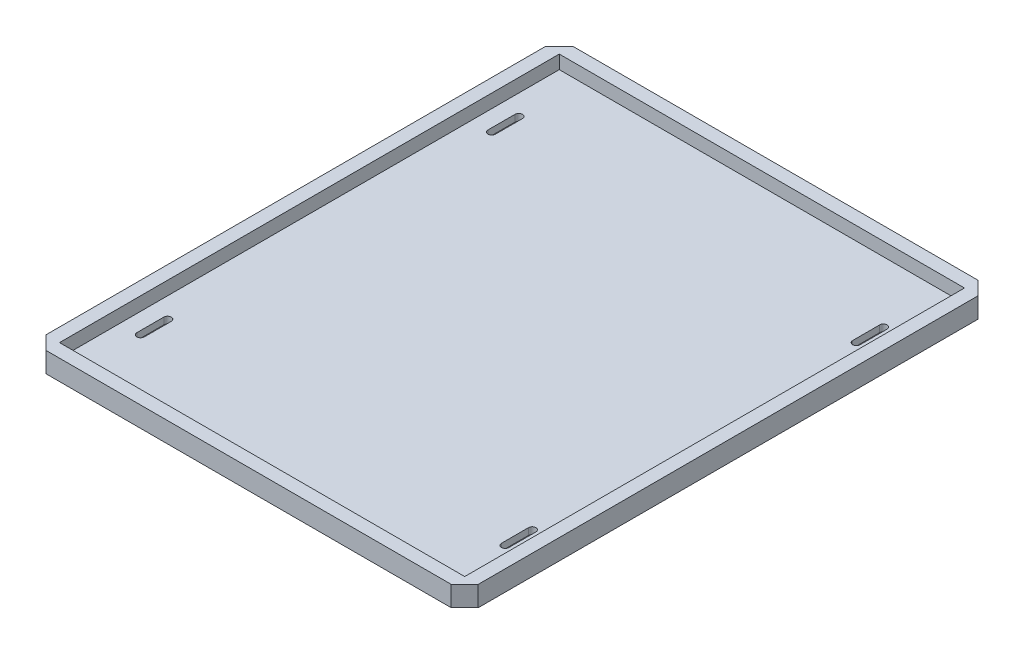
ISO-10303-21;
HEADER;
FILE_DESCRIPTION(('STEP AP214'),'2;1');
FILE_NAME('part.step','',(''),(''),'','','');
FILE_SCHEMA(('AUTOMOTIVE_DESIGN { 1 0 10303 214 1 1 1 1 }'));
ENDSEC;
DATA;
#1=APPLICATION_CONTEXT('core data for automotive mechanical design processes');
#2=APPLICATION_PROTOCOL_DEFINITION('international standard','automotive_design',2000,#1);
#3=PRODUCT_CONTEXT('',#1,'mechanical');
#4=PRODUCT('Part','Part','',(#3));
#5=PRODUCT_RELATED_PRODUCT_CATEGORY('part','',(#4));
#6=PRODUCT_DEFINITION_FORMATION('','',#4);
#7=PRODUCT_DEFINITION_CONTEXT('part definition',#1,'design');
#8=PRODUCT_DEFINITION('design','',#6,#7);
#9=PRODUCT_DEFINITION_SHAPE('','',#8);
#10=(LENGTH_UNIT() NAMED_UNIT(*) SI_UNIT(.MILLI.,.METRE.));
#11=(NAMED_UNIT(*) PLANE_ANGLE_UNIT() SI_UNIT($,.RADIAN.));
#12=(NAMED_UNIT(*) SI_UNIT($,.STERADIAN.) SOLID_ANGLE_UNIT());
#13=UNCERTAINTY_MEASURE_WITH_UNIT(LENGTH_MEASURE(1.E-05),#10,'distance_accuracy_value','');
#14=(GEOMETRIC_REPRESENTATION_CONTEXT(3) GLOBAL_UNCERTAINTY_ASSIGNED_CONTEXT((#13)) GLOBAL_UNIT_ASSIGNED_CONTEXT((#10,
#11,#12)) REPRESENTATION_CONTEXT('',''));
#15=CARTESIAN_POINT('',(0.,0.,0.));
#16=DIRECTION('',(0.,0.,1.));
#17=DIRECTION('',(1.,0.,0.));
#18=AXIS2_PLACEMENT_3D('',#15,#16,#17);
#19=CARTESIAN_POINT('',(0.,5.,0.));
#20=DIRECTION('',(0.,-1.,0.));
#21=DIRECTION('',(0.,0.,-1.));
#22=AXIS2_PLACEMENT_3D('',#19,#20,#21);
#23=PLANE('',#22);
#24=DIRECTION('',(1.,0.,0.));
#25=VECTOR('',#24,1.);
#26=CARTESIAN_POINT('',(0.,5.,185.));
#27=LINE('',#26,#25);
#28=CARTESIAN_POINT('',(-150.,5.,185.));
#29=VERTEX_POINT('',#28);
#30=CARTESIAN_POINT('',(150.,5.,185.));
#31=VERTEX_POINT('',#30);
#32=EDGE_CURVE('E291',#29,#31,#27,.T.);
#33=ORIENTED_EDGE('',*,*,#32,.T.);
#34=DIRECTION('',(0.,0.,-1.));
#35=VECTOR('',#34,1.);
#36=CARTESIAN_POINT('',(150.,5.,0.));
#37=LINE('',#36,#35);
#38=CARTESIAN_POINT('',(150.,5.,-185.));
#39=VERTEX_POINT('',#38);
#40=EDGE_CURVE('E301',#31,#39,#37,.T.);
#41=ORIENTED_EDGE('',*,*,#40,.T.);
#42=DIRECTION('',(-1.,0.,0.));
#43=VECTOR('',#42,1.);
#44=CARTESIAN_POINT('',(0.,5.,-185.));
#45=LINE('',#44,#43);
#46=CARTESIAN_POINT('',(-150.,5.,-185.));
#47=VERTEX_POINT('',#46);
#48=EDGE_CURVE('E253',#39,#47,#45,.T.);
#49=ORIENTED_EDGE('',*,*,#48,.T.);
#50=DIRECTION('',(0.,0.,1.));
#51=VECTOR('',#50,1.);
#52=CARTESIAN_POINT('',(-150.,5.,0.));
#53=LINE('',#52,#51);
#54=EDGE_CURVE('E295',#47,#29,#53,.T.);
#55=ORIENTED_EDGE('',*,*,#54,.T.);
#56=EDGE_LOOP('',(#33,#41,#49,#55));
#57=FACE_BOUND('',#56,.T.);
#58=CARTESIAN_POINT('',(135.,5.,-140.));
#59=DIRECTION('',(0.,-1.,0.));
#60=DIRECTION('',(0.,0.,-1.));
#61=AXIS2_PLACEMENT_3D('',#58,#59,#60);
#62=CIRCLE('',#61,2.74999999999997);
#63=CARTESIAN_POINT('',(132.25,5.,-140.));
#64=VERTEX_POINT('',#63);
#65=CARTESIAN_POINT('',(137.75,5.,-140.));
#66=VERTEX_POINT('',#65);
#67=EDGE_CURVE('E334',#64,#66,#62,.T.);
#68=ORIENTED_EDGE('',*,*,#67,.T.);
#69=DIRECTION('',(0.,0.,1.));
#70=VECTOR('',#69,1.);
#71=CARTESIAN_POINT('',(137.75,5.,-140.));
#72=LINE('',#71,#70);
#73=CARTESIAN_POINT('',(137.75,5.,-120.));
#74=VERTEX_POINT('',#73);
#75=EDGE_CURVE('E330',#66,#74,#72,.T.);
#76=ORIENTED_EDGE('',*,*,#75,.T.);
#77=CARTESIAN_POINT('',(135.,5.,-120.));
#78=DIRECTION('',(0.,-1.,0.));
#79=DIRECTION('',(0.,0.,-1.));
#80=AXIS2_PLACEMENT_3D('',#77,#78,#79);
#81=CIRCLE('',#80,2.74999999999997);
#82=CARTESIAN_POINT('',(132.25,5.,-120.));
#83=VERTEX_POINT('',#82);
#84=EDGE_CURVE('E325',#74,#83,#81,.T.);
#85=ORIENTED_EDGE('',*,*,#84,.T.);
#86=DIRECTION('',(0.,0.,1.));
#87=VECTOR('',#86,1.);
#88=CARTESIAN_POINT('',(132.25,5.,-140.));
#89=LINE('',#88,#87);
#90=EDGE_CURVE('E321',#64,#83,#89,.T.);
#91=ORIENTED_EDGE('',*,*,#90,.F.);
#92=EDGE_LOOP('',(#68,#76,#85,#91));
#93=FACE_BOUND('',#92,.T.);
#94=DIRECTION('',(0.,0.,1.));
#95=VECTOR('',#94,1.);
#96=CARTESIAN_POINT('',(-137.75,5.,-140.));
#97=LINE('',#96,#95);
#98=CARTESIAN_POINT('',(-137.75,5.,-140.));
#99=VERTEX_POINT('',#98);
#100=CARTESIAN_POINT('',(-137.75,5.,-120.));
#101=VERTEX_POINT('',#100);
#102=EDGE_CURVE('E455',#99,#101,#97,.T.);
#103=ORIENTED_EDGE('',*,*,#102,.F.);
#104=CARTESIAN_POINT('',(-135.,5.,-140.));
#105=DIRECTION('',(0.,1.,0.));
#106=DIRECTION('',(0.,0.,1.));
#107=AXIS2_PLACEMENT_3D('',#104,#105,#106);
#108=CIRCLE('',#107,2.74999999999997);
#109=CARTESIAN_POINT('',(-132.25,5.,-140.));
#110=VERTEX_POINT('',#109);
#111=EDGE_CURVE('E338',#110,#99,#108,.T.);
#112=ORIENTED_EDGE('',*,*,#111,.F.);
#113=DIRECTION('',(0.,0.,1.));
#114=VECTOR('',#113,1.);
#115=CARTESIAN_POINT('',(-132.25,5.,-140.));
#116=LINE('',#115,#114);
#117=CARTESIAN_POINT('',(-132.25,5.,-120.));
#118=VERTEX_POINT('',#117);
#119=EDGE_CURVE('E441',#110,#118,#116,.T.);
#120=ORIENTED_EDGE('',*,*,#119,.T.);
#121=CARTESIAN_POINT('',(-135.,5.,-120.));
#122=DIRECTION('',(0.,1.,0.));
#123=DIRECTION('',(0.,0.,1.));
#124=AXIS2_PLACEMENT_3D('',#121,#122,#123);
#125=CIRCLE('',#124,2.74999999999997);
#126=EDGE_CURVE('E459',#101,#118,#125,.T.);
#127=ORIENTED_EDGE('',*,*,#126,.F.);
#128=EDGE_LOOP('',(#103,#112,#120,#127));
#129=FACE_BOUND('',#128,.T.);
#130=DIRECTION('',(0.,0.,-1.));
#131=VECTOR('',#130,1.);
#132=CARTESIAN_POINT('',(137.75,5.,140.));
#133=LINE('',#132,#131);
#134=CARTESIAN_POINT('',(137.75,5.,140.));
#135=VERTEX_POINT('',#134);
#136=CARTESIAN_POINT('',(137.75,5.,120.));
#137=VERTEX_POINT('',#136);
#138=EDGE_CURVE('E375',#135,#137,#133,.T.);
#139=ORIENTED_EDGE('',*,*,#138,.F.);
#140=CARTESIAN_POINT('',(135.,5.,140.));
#141=DIRECTION('',(0.,1.,0.));
#142=DIRECTION('',(0.,0.,1.));
#143=AXIS2_PLACEMENT_3D('',#140,#141,#142);
#144=CIRCLE('',#143,2.74999999999997);
#145=CARTESIAN_POINT('',(132.25,5.,140.));
#146=VERTEX_POINT('',#145);
#147=EDGE_CURVE('E310',#146,#135,#144,.T.);
#148=ORIENTED_EDGE('',*,*,#147,.F.);
#149=DIRECTION('',(0.,0.,-1.));
#150=VECTOR('',#149,1.);
#151=CARTESIAN_POINT('',(132.25,5.,140.));
#152=LINE('',#151,#150);
#153=CARTESIAN_POINT('',(132.25,5.,120.));
#154=VERTEX_POINT('',#153);
#155=EDGE_CURVE('E366',#146,#154,#152,.T.);
#156=ORIENTED_EDGE('',*,*,#155,.T.);
#157=CARTESIAN_POINT('',(135.,5.,120.));
#158=DIRECTION('',(0.,1.,0.));
#159=DIRECTION('',(0.,0.,1.));
#160=AXIS2_PLACEMENT_3D('',#157,#158,#159);
#161=CIRCLE('',#160,2.74999999999997);
#162=EDGE_CURVE('E370',#137,#154,#161,.T.);
#163=ORIENTED_EDGE('',*,*,#162,.F.);
#164=EDGE_LOOP('',(#139,#148,#156,#163));
#165=FACE_BOUND('',#164,.T.);
#166=CARTESIAN_POINT('',(-135.,5.,140.));
#167=DIRECTION('',(0.,-1.,0.));
#168=DIRECTION('',(0.,0.,-1.));
#169=AXIS2_PLACEMENT_3D('',#166,#167,#168);
#170=CIRCLE('',#169,2.74999999999997);
#171=CARTESIAN_POINT('',(-132.25,5.,140.));
#172=VERTEX_POINT('',#171);
#173=CARTESIAN_POINT('',(-137.75,5.,140.));
#174=VERTEX_POINT('',#173);
#175=EDGE_CURVE('E365',#172,#174,#170,.T.);
#176=ORIENTED_EDGE('',*,*,#175,.T.);
#177=DIRECTION('',(0.,0.,-1.));
#178=VECTOR('',#177,1.);
#179=CARTESIAN_POINT('',(-137.75,5.,140.));
#180=LINE('',#179,#178);
#181=CARTESIAN_POINT('',(-137.75,5.,120.));
#182=VERTEX_POINT('',#181);
#183=EDGE_CURVE('E417',#174,#182,#180,.T.);
#184=ORIENTED_EDGE('',*,*,#183,.T.);
#185=CARTESIAN_POINT('',(-135.,5.,120.));
#186=DIRECTION('',(0.,-1.,0.));
#187=DIRECTION('',(0.,0.,-1.));
#188=AXIS2_PLACEMENT_3D('',#185,#186,#187);
#189=CIRCLE('',#188,2.74999999999997);
#190=CARTESIAN_POINT('',(-132.25,5.,120.));
#191=VERTEX_POINT('',#190);
#192=EDGE_CURVE('E412',#182,#191,#189,.T.);
#193=ORIENTED_EDGE('',*,*,#192,.T.);
#194=DIRECTION('',(0.,0.,-1.));
#195=VECTOR('',#194,1.);
#196=CARTESIAN_POINT('',(-132.25,5.,140.));
#197=LINE('',#196,#195);
#198=EDGE_CURVE('E408',#172,#191,#197,.T.);
#199=ORIENTED_EDGE('',*,*,#198,.F.);
#200=EDGE_LOOP('',(#176,#184,#193,#199));
#201=FACE_BOUND('',#200,.T.);
#202=ADVANCED_FACE('F47',(#57,#93,#129,#165,#201),#23,.F.);
#203=CARTESIAN_POINT('',(0.,0.,0.));
#204=DIRECTION('',(0.,-1.,0.));
#205=DIRECTION('',(0.,0.,-1.));
#206=AXIS2_PLACEMENT_3D('',#203,#204,#205);
#207=PLANE('',#206);
#208=CARTESIAN_POINT('',(135.,0.,140.));
#209=DIRECTION('',(0.,1.,0.));
#210=DIRECTION('',(0.,0.,1.));
#211=AXIS2_PLACEMENT_3D('',#208,#209,#210);
#212=CIRCLE('',#211,2.74999999999997);
#213=CARTESIAN_POINT('',(132.25,0.,140.));
#214=VERTEX_POINT('',#213);
#215=CARTESIAN_POINT('',(137.75,0.,140.));
#216=VERTEX_POINT('',#215);
#217=EDGE_CURVE('E371',#214,#216,#212,.T.);
#218=ORIENTED_EDGE('',*,*,#217,.T.);
#219=DIRECTION('',(0.,0.,-1.));
#220=VECTOR('',#219,1.);
#221=CARTESIAN_POINT('',(137.75,0.,140.));
#222=LINE('',#221,#220);
#223=CARTESIAN_POINT('',(137.75,0.,120.));
#224=VERTEX_POINT('',#223);
#225=EDGE_CURVE('E387',#216,#224,#222,.T.);
#226=ORIENTED_EDGE('',*,*,#225,.T.);
#227=CARTESIAN_POINT('',(135.,0.,120.));
#228=DIRECTION('',(0.,1.,0.));
#229=DIRECTION('',(0.,0.,1.));
#230=AXIS2_PLACEMENT_3D('',#227,#228,#229);
#231=CIRCLE('',#230,2.74999999999997);
#232=CARTESIAN_POINT('',(132.25,0.,120.));
#233=VERTEX_POINT('',#232);
#234=EDGE_CURVE('E383',#224,#233,#231,.T.);
#235=ORIENTED_EDGE('',*,*,#234,.T.);
#236=DIRECTION('',(0.,0.,-1.));
#237=VECTOR('',#236,1.);
#238=CARTESIAN_POINT('',(132.25,0.,140.));
#239=LINE('',#238,#237);
#240=EDGE_CURVE('E355',#214,#233,#239,.T.);
#241=ORIENTED_EDGE('',*,*,#240,.F.);
#242=EDGE_LOOP('',(#218,#226,#235,#241));
#243=FACE_BOUND('',#242,.T.);
#244=CARTESIAN_POINT('',(-135.,0.,-140.));
#245=DIRECTION('',(0.,1.,0.));
#246=DIRECTION('',(0.,0.,1.));
#247=AXIS2_PLACEMENT_3D('',#244,#245,#246);
#248=CIRCLE('',#247,2.74999999999997);
#249=CARTESIAN_POINT('',(-132.25,0.,-140.));
#250=VERTEX_POINT('',#249);
#251=CARTESIAN_POINT('',(-137.75,0.,-140.));
#252=VERTEX_POINT('',#251);
#253=EDGE_CURVE('E436',#250,#252,#248,.T.);
#254=ORIENTED_EDGE('',*,*,#253,.T.);
#255=DIRECTION('',(0.,0.,1.));
#256=VECTOR('',#255,1.);
#257=CARTESIAN_POINT('',(-137.75,0.,-140.));
#258=LINE('',#257,#256);
#259=CARTESIAN_POINT('',(-137.75,0.,-120.));
#260=VERTEX_POINT('',#259);
#261=EDGE_CURVE('E440',#252,#260,#258,.T.);
#262=ORIENTED_EDGE('',*,*,#261,.T.);
#263=CARTESIAN_POINT('',(-135.,0.,-120.));
#264=DIRECTION('',(0.,1.,0.));
#265=DIRECTION('',(0.,0.,1.));
#266=AXIS2_PLACEMENT_3D('',#263,#264,#265);
#267=CIRCLE('',#266,2.74999999999997);
#268=CARTESIAN_POINT('',(-132.25,0.,-120.));
#269=VERTEX_POINT('',#268);
#270=EDGE_CURVE('E445',#260,#269,#267,.T.);
#271=ORIENTED_EDGE('',*,*,#270,.T.);
#272=DIRECTION('',(0.,0.,1.));
#273=VECTOR('',#272,1.);
#274=CARTESIAN_POINT('',(-132.25,0.,-140.));
#275=LINE('',#274,#273);
#276=EDGE_CURVE('E449',#250,#269,#275,.T.);
#277=ORIENTED_EDGE('',*,*,#276,.F.);
#278=EDGE_LOOP('',(#254,#262,#271,#277));
#279=FACE_BOUND('',#278,.T.);
#280=DIRECTION('',(0.,0.,1.));
#281=VECTOR('',#280,1.);
#282=CARTESIAN_POINT('',(137.75,0.,-140.));
#283=LINE('',#282,#281);
#284=CARTESIAN_POINT('',(137.75,0.,-140.));
#285=VERTEX_POINT('',#284);
#286=CARTESIAN_POINT('',(137.75,0.,-120.));
#287=VERTEX_POINT('',#286);
#288=EDGE_CURVE('E346',#285,#287,#283,.T.);
#289=ORIENTED_EDGE('',*,*,#288,.F.);
#290=CARTESIAN_POINT('',(135.,0.,-140.));
#291=DIRECTION('',(0.,-1.,0.));
#292=DIRECTION('',(0.,0.,-1.));
#293=AXIS2_PLACEMENT_3D('',#290,#291,#292);
#294=CIRCLE('',#293,2.74999999999997);
#295=CARTESIAN_POINT('',(132.25,0.,-140.));
#296=VERTEX_POINT('',#295);
#297=EDGE_CURVE('E326',#296,#285,#294,.T.);
#298=ORIENTED_EDGE('',*,*,#297,.F.);
#299=DIRECTION('',(0.,0.,1.));
#300=VECTOR('',#299,1.);
#301=CARTESIAN_POINT('',(132.25,0.,-140.));
#302=LINE('',#301,#300);
#303=CARTESIAN_POINT('',(132.25,0.,-120.));
#304=VERTEX_POINT('',#303);
#305=EDGE_CURVE('E320',#296,#304,#302,.T.);
#306=ORIENTED_EDGE('',*,*,#305,.T.);
#307=CARTESIAN_POINT('',(135.,0.,-120.));
#308=DIRECTION('',(0.,-1.,0.));
#309=DIRECTION('',(0.,0.,-1.));
#310=AXIS2_PLACEMENT_3D('',#307,#308,#309);
#311=CIRCLE('',#310,2.74999999999997);
#312=EDGE_CURVE('E342',#287,#304,#311,.T.);
#313=ORIENTED_EDGE('',*,*,#312,.F.);
#314=EDGE_LOOP('',(#289,#298,#306,#313));
#315=FACE_BOUND('',#314,.T.);
#316=DIRECTION('',(0.,0.,-1.));
#317=VECTOR('',#316,1.);
#318=CARTESIAN_POINT('',(-137.75,0.,140.));
#319=LINE('',#318,#317);
#320=CARTESIAN_POINT('',(-137.75,0.,140.));
#321=VERTEX_POINT('',#320);
#322=CARTESIAN_POINT('',(-137.75,0.,120.));
#323=VERTEX_POINT('',#322);
#324=EDGE_CURVE('E431',#321,#323,#319,.T.);
#325=ORIENTED_EDGE('',*,*,#324,.F.);
#326=CARTESIAN_POINT('',(-135.,0.,140.));
#327=DIRECTION('',(0.,-1.,0.));
#328=DIRECTION('',(0.,0.,-1.));
#329=AXIS2_PLACEMENT_3D('',#326,#327,#328);
#330=CIRCLE('',#329,2.74999999999997);
#331=CARTESIAN_POINT('',(-132.25,0.,140.));
#332=VERTEX_POINT('',#331);
#333=EDGE_CURVE('E413',#332,#321,#330,.T.);
#334=ORIENTED_EDGE('',*,*,#333,.F.);
#335=DIRECTION('',(0.,0.,-1.));
#336=VECTOR('',#335,1.);
#337=CARTESIAN_POINT('',(-132.25,0.,140.));
#338=LINE('',#337,#336);
#339=CARTESIAN_POINT('',(-132.25,0.,120.));
#340=VERTEX_POINT('',#339);
#341=EDGE_CURVE('E407',#332,#340,#338,.T.);
#342=ORIENTED_EDGE('',*,*,#341,.T.);
#343=CARTESIAN_POINT('',(-135.,0.,120.));
#344=DIRECTION('',(0.,-1.,0.));
#345=DIRECTION('',(0.,0.,-1.));
#346=AXIS2_PLACEMENT_3D('',#343,#344,#345);
#347=CIRCLE('',#346,2.74999999999997);
#348=EDGE_CURVE('E427',#323,#340,#347,.T.);
#349=ORIENTED_EDGE('',*,*,#348,.F.);
#350=EDGE_LOOP('',(#325,#334,#342,#349));
#351=FACE_BOUND('',#350,.T.);
#352=DIRECTION('',(0.,0.,1.));
#353=VECTOR('',#352,1.);
#354=CARTESIAN_POINT('',(-160.,0.,-195.));
#355=LINE('',#354,#353);
#356=CARTESIAN_POINT('',(-160.,0.,-185.));
#357=VERTEX_POINT('',#356);
#358=CARTESIAN_POINT('',(-160.,0.,185.));
#359=VERTEX_POINT('',#358);
#360=EDGE_CURVE('E489',#357,#359,#355,.T.);
#361=ORIENTED_EDGE('',*,*,#360,.F.);
#362=DIRECTION('',(0.707106781186549,0.,-0.707106781186546));
#363=VECTOR('',#362,1.);
#364=CARTESIAN_POINT('',(-172.5,0.,-172.500000000001));
#365=LINE('',#364,#363);
#366=CARTESIAN_POINT('',(-150.,0.,-195.));
#367=VERTEX_POINT('',#366);
#368=EDGE_CURVE('E509',#357,#367,#365,.T.);
#369=ORIENTED_EDGE('',*,*,#368,.T.);
#370=DIRECTION('',(1.,0.,0.));
#371=VECTOR('',#370,1.);
#372=CARTESIAN_POINT('',(-160.,0.,-195.));
#373=LINE('',#372,#371);
#374=CARTESIAN_POINT('',(150.,0.,-195.));
#375=VERTEX_POINT('',#374);
#376=EDGE_CURVE('E469',#367,#375,#373,.T.);
#377=ORIENTED_EDGE('',*,*,#376,.T.);
#378=DIRECTION('',(-0.707106781186546,0.,-0.707106781186549));
#379=VECTOR('',#378,1.);
#380=CARTESIAN_POINT('',(172.5,0.,-172.499999999999));
#381=LINE('',#380,#379);
#382=CARTESIAN_POINT('',(160.,0.,-185.));
#383=VERTEX_POINT('',#382);
#384=EDGE_CURVE('E506',#375,#383,#381,.F.);
#385=ORIENTED_EDGE('',*,*,#384,.T.);
#386=DIRECTION('',(0.,0.,1.));
#387=VECTOR('',#386,1.);
#388=CARTESIAN_POINT('',(160.,0.,-195.));
#389=LINE('',#388,#387);
#390=CARTESIAN_POINT('',(160.,0.,185.));
#391=VERTEX_POINT('',#390);
#392=EDGE_CURVE('E482',#383,#391,#389,.T.);
#393=ORIENTED_EDGE('',*,*,#392,.T.);
#394=DIRECTION('',(-0.707106781186548,0.,0.707106781186548));
#395=VECTOR('',#394,1.);
#396=CARTESIAN_POINT('',(172.5,0.,172.5));
#397=LINE('',#396,#395);
#398=CARTESIAN_POINT('',(150.,0.,195.));
#399=VERTEX_POINT('',#398);
#400=EDGE_CURVE('E503',#391,#399,#397,.T.);
#401=ORIENTED_EDGE('',*,*,#400,.T.);
#402=DIRECTION('',(1.,0.,0.));
#403=VECTOR('',#402,1.);
#404=CARTESIAN_POINT('',(-160.,0.,195.));
#405=LINE('',#404,#403);
#406=CARTESIAN_POINT('',(-150.,0.,195.));
#407=VERTEX_POINT('',#406);
#408=EDGE_CURVE('E486',#407,#399,#405,.T.);
#409=ORIENTED_EDGE('',*,*,#408,.F.);
#410=DIRECTION('',(0.707106781186546,0.,0.707106781186549));
#411=VECTOR('',#410,1.);
#412=CARTESIAN_POINT('',(-172.5,0.,172.499999999999));
#413=LINE('',#412,#411);
#414=EDGE_CURVE('E500',#407,#359,#413,.F.);
#415=ORIENTED_EDGE('',*,*,#414,.T.);
#416=EDGE_LOOP('',(#361,#369,#377,#385,#393,#401,#409,#415));
#417=FACE_BOUND('',#416,.T.);
#418=ADVANCED_FACE('F544',(#243,#279,#315,#351,#417),#207,.T.);
#419=CARTESIAN_POINT('',(-160.,5.,-195.));
#420=DIRECTION('',(0.,0.,-1.));
#421=DIRECTION('',(-1.,0.,0.));
#422=AXIS2_PLACEMENT_3D('',#419,#420,#421);
#423=PLANE('',#422);
#424=ORIENTED_EDGE('',*,*,#376,.F.);
#425=DIRECTION('',(0.,1.,0.));
#426=VECTOR('',#425,1.);
#427=CARTESIAN_POINT('',(-150.,15.,-195.));
#428=LINE('',#427,#426);
#429=CARTESIAN_POINT('',(-150.,15.,-195.));
#430=VERTEX_POINT('',#429);
#431=EDGE_CURVE('E516',#367,#430,#428,.T.);
#432=ORIENTED_EDGE('',*,*,#431,.T.);
#433=DIRECTION('',(-1.,0.,0.));
#434=VECTOR('',#433,1.);
#435=CARTESIAN_POINT('',(-160.,15.,-195.));
#436=LINE('',#435,#434);
#437=CARTESIAN_POINT('',(150.,15.,-195.));
#438=VERTEX_POINT('',#437);
#439=EDGE_CURVE('E281',#438,#430,#436,.T.);
#440=ORIENTED_EDGE('',*,*,#439,.F.);
#441=DIRECTION('',(0.,-1.,0.));
#442=VECTOR('',#441,1.);
#443=CARTESIAN_POINT('',(150.,5.,-195.));
#444=LINE('',#443,#442);
#445=EDGE_CURVE('E512',#438,#375,#444,.T.);
#446=ORIENTED_EDGE('',*,*,#445,.T.);
#447=EDGE_LOOP('',(#424,#432,#440,#446));
#448=FACE_BOUND('',#447,.T.);
#449=ADVANCED_FACE('F561',(#448),#423,.T.);
#450=CARTESIAN_POINT('',(-160.,5.,-195.));
#451=DIRECTION('',(1.,0.,0.));
#452=DIRECTION('',(0.,0.,-1.));
#453=AXIS2_PLACEMENT_3D('',#450,#451,#452);
#454=PLANE('',#453);
#455=DIRECTION('',(0.,0.,1.));
#456=VECTOR('',#455,1.);
#457=CARTESIAN_POINT('',(-160.,15.,-195.));
#458=LINE('',#457,#456);
#459=CARTESIAN_POINT('',(-160.,15.,-185.));
#460=VERTEX_POINT('',#459);
#461=CARTESIAN_POINT('',(-160.,15.,185.));
#462=VERTEX_POINT('',#461);
#463=EDGE_CURVE('E285',#460,#462,#458,.T.);
#464=ORIENTED_EDGE('',*,*,#463,.F.);
#465=DIRECTION('',(0.,-1.,0.));
#466=VECTOR('',#465,1.);
#467=CARTESIAN_POINT('',(-160.,0.,-185.));
#468=LINE('',#467,#466);
#469=EDGE_CURVE('E496',#460,#357,#468,.T.);
#470=ORIENTED_EDGE('',*,*,#469,.T.);
#471=ORIENTED_EDGE('',*,*,#360,.T.);
#472=DIRECTION('',(0.,1.,0.));
#473=VECTOR('',#472,1.);
#474=CARTESIAN_POINT('',(-160.,5.,185.));
#475=LINE('',#474,#473);
#476=EDGE_CURVE('E493',#359,#462,#475,.T.);
#477=ORIENTED_EDGE('',*,*,#476,.T.);
#478=EDGE_LOOP('',(#464,#470,#471,#477));
#479=FACE_BOUND('',#478,.T.);
#480=ADVANCED_FACE('F569',(#479),#454,.F.);
#481=CARTESIAN_POINT('',(-160.,5.,195.));
#482=DIRECTION('',(0.,0.,-1.));
#483=DIRECTION('',(-1.,0.,0.));
#484=AXIS2_PLACEMENT_3D('',#481,#482,#483);
#485=PLANE('',#484);
#486=ORIENTED_EDGE('',*,*,#408,.T.);
#487=DIRECTION('',(0.,1.,0.));
#488=VECTOR('',#487,1.);
#489=CARTESIAN_POINT('',(150.,15.,195.));
#490=LINE('',#489,#488);
#491=CARTESIAN_POINT('',(150.,15.,195.));
#492=VERTEX_POINT('',#491);
#493=EDGE_CURVE('E11',#399,#492,#490,.T.);
#494=ORIENTED_EDGE('',*,*,#493,.T.);
#495=DIRECTION('',(1.,0.,0.));
#496=VECTOR('',#495,1.);
#497=CARTESIAN_POINT('',(-160.,15.,195.));
#498=LINE('',#497,#496);
#499=CARTESIAN_POINT('',(-150.,15.,195.));
#500=VERTEX_POINT('',#499);
#501=EDGE_CURVE('E288',#500,#492,#498,.T.);
#502=ORIENTED_EDGE('',*,*,#501,.F.);
#503=DIRECTION('',(0.,-1.,0.));
#504=VECTOR('',#503,1.);
#505=CARTESIAN_POINT('',(-150.,5.,195.));
#506=LINE('',#505,#504);
#507=EDGE_CURVE('E57',#500,#407,#506,.T.);
#508=ORIENTED_EDGE('',*,*,#507,.T.);
#509=EDGE_LOOP('',(#486,#494,#502,#508));
#510=FACE_BOUND('',#509,.T.);
#511=ADVANCED_FACE('F540',(#510),#485,.F.);
#512=CARTESIAN_POINT('',(160.,5.,-195.));
#513=DIRECTION('',(1.,0.,0.));
#514=DIRECTION('',(0.,0.,-1.));
#515=AXIS2_PLACEMENT_3D('',#512,#513,#514);
#516=PLANE('',#515);
#517=ORIENTED_EDGE('',*,*,#392,.F.);
#518=DIRECTION('',(0.,1.,0.));
#519=VECTOR('',#518,1.);
#520=CARTESIAN_POINT('',(160.,5.,-185.));
#521=LINE('',#520,#519);
#522=CARTESIAN_POINT('',(160.,15.,-185.));
#523=VERTEX_POINT('',#522);
#524=EDGE_CURVE('E534',#383,#523,#521,.T.);
#525=ORIENTED_EDGE('',*,*,#524,.T.);
#526=DIRECTION('',(0.,0.,-1.));
#527=VECTOR('',#526,1.);
#528=CARTESIAN_POINT('',(160.,15.,-195.));
#529=LINE('',#528,#527);
#530=CARTESIAN_POINT('',(160.,15.,185.));
#531=VERTEX_POINT('',#530);
#532=EDGE_CURVE('E255',#531,#523,#529,.T.);
#533=ORIENTED_EDGE('',*,*,#532,.F.);
#534=DIRECTION('',(0.,-1.,0.));
#535=VECTOR('',#534,1.);
#536=CARTESIAN_POINT('',(160.,0.,185.));
#537=LINE('',#536,#535);
#538=EDGE_CURVE('E530',#531,#391,#537,.T.);
#539=ORIENTED_EDGE('',*,*,#538,.T.);
#540=EDGE_LOOP('',(#517,#525,#533,#539));
#541=FACE_BOUND('',#540,.T.);
#542=ADVANCED_FACE('F552',(#541),#516,.T.);
#543=CARTESIAN_POINT('',(-135.,0.,-140.));
#544=DIRECTION('',(0.,1.,0.));
#545=DIRECTION('',(0.,0.,1.));
#546=AXIS2_PLACEMENT_3D('',#543,#544,#545);
#547=CYLINDRICAL_SURFACE('',#546,2.74999999999997);
#548=ORIENTED_EDGE('',*,*,#111,.T.);
#549=DIRECTION('',(0.,1.,0.));
#550=VECTOR('',#549,1.);
#551=CARTESIAN_POINT('',(-137.75,0.,-140.));
#552=LINE('',#551,#550);
#553=EDGE_CURVE('E452',#252,#99,#552,.T.);
#554=ORIENTED_EDGE('',*,*,#553,.F.);
#555=ORIENTED_EDGE('',*,*,#253,.F.);
#556=DIRECTION('',(0.,1.,0.));
#557=VECTOR('',#556,1.);
#558=CARTESIAN_POINT('',(-132.25,0.,-140.));
#559=LINE('',#558,#557);
#560=EDGE_CURVE('E466',#250,#110,#559,.T.);
#561=ORIENTED_EDGE('',*,*,#560,.T.);
#562=EDGE_LOOP('',(#548,#554,#555,#561));
#563=FACE_BOUND('',#562,.T.);
#564=ADVANCED_FACE('F587',(#563),#547,.F.);
#565=CARTESIAN_POINT('',(-132.25,0.,-140.));
#566=DIRECTION('',(-1.,0.,0.));
#567=DIRECTION('',(0.,0.,1.));
#568=AXIS2_PLACEMENT_3D('',#565,#566,#567);
#569=PLANE('',#568);
#570=ORIENTED_EDGE('',*,*,#119,.F.);
#571=ORIENTED_EDGE('',*,*,#560,.F.);
#572=ORIENTED_EDGE('',*,*,#276,.T.);
#573=DIRECTION('',(0.,1.,0.));
#574=VECTOR('',#573,1.);
#575=CARTESIAN_POINT('',(-132.25,0.,-120.));
#576=LINE('',#575,#574);
#577=EDGE_CURVE('E470',#269,#118,#576,.T.);
#578=ORIENTED_EDGE('',*,*,#577,.T.);
#579=EDGE_LOOP('',(#570,#571,#572,#578));
#580=FACE_BOUND('',#579,.T.);
#581=ADVANCED_FACE('F795',(#580),#569,.T.);
#582=CARTESIAN_POINT('',(-135.,0.,-120.));
#583=DIRECTION('',(0.,1.,0.));
#584=DIRECTION('',(0.,0.,1.));
#585=AXIS2_PLACEMENT_3D('',#582,#583,#584);
#586=CYLINDRICAL_SURFACE('',#585,2.74999999999997);
#587=ORIENTED_EDGE('',*,*,#126,.T.);
#588=ORIENTED_EDGE('',*,*,#577,.F.);
#589=ORIENTED_EDGE('',*,*,#270,.F.);
#590=DIRECTION('',(0.,1.,0.));
#591=VECTOR('',#590,1.);
#592=CARTESIAN_POINT('',(-137.75,0.,-120.));
#593=LINE('',#592,#591);
#594=EDGE_CURVE('E473',#260,#101,#593,.T.);
#595=ORIENTED_EDGE('',*,*,#594,.T.);
#596=EDGE_LOOP('',(#587,#588,#589,#595));
#597=FACE_BOUND('',#596,.T.);
#598=ADVANCED_FACE('F787',(#597),#586,.F.);
#599=CARTESIAN_POINT('',(-137.75,0.,-140.));
#600=DIRECTION('',(-1.,0.,0.));
#601=DIRECTION('',(0.,0.,1.));
#602=AXIS2_PLACEMENT_3D('',#599,#600,#601);
#603=PLANE('',#602);
#604=ORIENTED_EDGE('',*,*,#102,.T.);
#605=ORIENTED_EDGE('',*,*,#594,.F.);
#606=ORIENTED_EDGE('',*,*,#261,.F.);
#607=ORIENTED_EDGE('',*,*,#553,.T.);
#608=EDGE_LOOP('',(#604,#605,#606,#607));
#609=FACE_BOUND('',#608,.T.);
#610=ADVANCED_FACE('F778',(#609),#603,.F.);
#611=CARTESIAN_POINT('',(135.,0.,-140.));
#612=DIRECTION('',(0.,1.,0.));
#613=DIRECTION('',(0.,0.,1.));
#614=AXIS2_PLACEMENT_3D('',#611,#612,#613);
#615=CYLINDRICAL_SURFACE('',#614,2.74999999999997);
#616=ORIENTED_EDGE('',*,*,#67,.F.);
#617=DIRECTION('',(0.,1.,0.));
#618=VECTOR('',#617,1.);
#619=CARTESIAN_POINT('',(132.25,0.,-140.));
#620=LINE('',#619,#618);
#621=EDGE_CURVE('E316',#296,#64,#620,.T.);
#622=ORIENTED_EDGE('',*,*,#621,.F.);
#623=ORIENTED_EDGE('',*,*,#297,.T.);
#624=DIRECTION('',(0.,1.,0.));
#625=VECTOR('',#624,1.);
#626=CARTESIAN_POINT('',(137.75,0.,-140.));
#627=LINE('',#626,#625);
#628=EDGE_CURVE('E305',#285,#66,#627,.T.);
#629=ORIENTED_EDGE('',*,*,#628,.T.);
#630=EDGE_LOOP('',(#616,#622,#623,#629));
#631=FACE_BOUND('',#630,.T.);
#632=ADVANCED_FACE('F769',(#631),#615,.F.);
#633=CARTESIAN_POINT('',(137.75,0.,-140.));
#634=DIRECTION('',(-1.,0.,0.));
#635=DIRECTION('',(0.,0.,1.));
#636=AXIS2_PLACEMENT_3D('',#633,#634,#635);
#637=PLANE('',#636);
#638=ORIENTED_EDGE('',*,*,#75,.F.);
#639=ORIENTED_EDGE('',*,*,#628,.F.);
#640=ORIENTED_EDGE('',*,*,#288,.T.);
#641=DIRECTION('',(0.,1.,0.));
#642=VECTOR('',#641,1.);
#643=CARTESIAN_POINT('',(137.75,0.,-120.));
#644=LINE('',#643,#642);
#645=EDGE_CURVE('E309',#287,#74,#644,.T.);
#646=ORIENTED_EDGE('',*,*,#645,.T.);
#647=EDGE_LOOP('',(#638,#639,#640,#646));
#648=FACE_BOUND('',#647,.T.);
#649=ADVANCED_FACE('F760',(#648),#637,.T.);
#650=CARTESIAN_POINT('',(135.,0.,-120.));
#651=DIRECTION('',(0.,1.,0.));
#652=DIRECTION('',(0.,0.,1.));
#653=AXIS2_PLACEMENT_3D('',#650,#651,#652);
#654=CYLINDRICAL_SURFACE('',#653,2.74999999999997);
#655=ORIENTED_EDGE('',*,*,#84,.F.);
#656=ORIENTED_EDGE('',*,*,#645,.F.);
#657=ORIENTED_EDGE('',*,*,#312,.T.);
#658=DIRECTION('',(0.,1.,0.));
#659=VECTOR('',#658,1.);
#660=CARTESIAN_POINT('',(132.25,0.,-120.));
#661=LINE('',#660,#659);
#662=EDGE_CURVE('E313',#304,#83,#661,.T.);
#663=ORIENTED_EDGE('',*,*,#662,.T.);
#664=EDGE_LOOP('',(#655,#656,#657,#663));
#665=FACE_BOUND('',#664,.T.);
#666=ADVANCED_FACE('F751',(#665),#654,.F.);
#667=CARTESIAN_POINT('',(132.25,0.,-140.));
#668=DIRECTION('',(-1.,0.,0.));
#669=DIRECTION('',(0.,0.,1.));
#670=AXIS2_PLACEMENT_3D('',#667,#668,#669);
#671=PLANE('',#670);
#672=ORIENTED_EDGE('',*,*,#90,.T.);
#673=ORIENTED_EDGE('',*,*,#662,.F.);
#674=ORIENTED_EDGE('',*,*,#305,.F.);
#675=ORIENTED_EDGE('',*,*,#621,.T.);
#676=EDGE_LOOP('',(#672,#673,#674,#675));
#677=FACE_BOUND('',#676,.T.);
#678=ADVANCED_FACE('F742',(#677),#671,.F.);
#679=CARTESIAN_POINT('',(135.,0.,140.));
#680=DIRECTION('',(0.,1.,0.));
#681=DIRECTION('',(0.,0.,1.));
#682=AXIS2_PLACEMENT_3D('',#679,#680,#681);
#683=CYLINDRICAL_SURFACE('',#682,2.74999999999997);
#684=ORIENTED_EDGE('',*,*,#147,.T.);
#685=DIRECTION('',(0.,1.,0.));
#686=VECTOR('',#685,1.);
#687=CARTESIAN_POINT('',(137.75,0.,140.));
#688=LINE('',#687,#686);
#689=EDGE_CURVE('E351',#216,#135,#688,.T.);
#690=ORIENTED_EDGE('',*,*,#689,.F.);
#691=ORIENTED_EDGE('',*,*,#217,.F.);
#692=DIRECTION('',(0.,1.,0.));
#693=VECTOR('',#692,1.);
#694=CARTESIAN_POINT('',(132.25,0.,140.));
#695=LINE('',#694,#693);
#696=EDGE_CURVE('E362',#214,#146,#695,.T.);
#697=ORIENTED_EDGE('',*,*,#696,.T.);
#698=EDGE_LOOP('',(#684,#690,#691,#697));
#699=FACE_BOUND('',#698,.T.);
#700=ADVANCED_FACE('F733',(#699),#683,.F.);
#701=CARTESIAN_POINT('',(132.25,0.,140.));
#702=DIRECTION('',(1.,0.,0.));
#703=DIRECTION('',(0.,0.,-1.));
#704=AXIS2_PLACEMENT_3D('',#701,#702,#703);
#705=PLANE('',#704);
#706=ORIENTED_EDGE('',*,*,#155,.F.);
#707=ORIENTED_EDGE('',*,*,#696,.F.);
#708=ORIENTED_EDGE('',*,*,#240,.T.);
#709=DIRECTION('',(0.,1.,0.));
#710=VECTOR('',#709,1.);
#711=CARTESIAN_POINT('',(132.25,0.,120.));
#712=LINE('',#711,#710);
#713=EDGE_CURVE('E359',#233,#154,#712,.T.);
#714=ORIENTED_EDGE('',*,*,#713,.T.);
#715=EDGE_LOOP('',(#706,#707,#708,#714));
#716=FACE_BOUND('',#715,.T.);
#717=ADVANCED_FACE('F724',(#716),#705,.T.);
#718=CARTESIAN_POINT('',(135.,0.,120.));
#719=DIRECTION('',(0.,1.,0.));
#720=DIRECTION('',(0.,0.,1.));
#721=AXIS2_PLACEMENT_3D('',#718,#719,#720);
#722=CYLINDRICAL_SURFACE('',#721,2.74999999999997);
#723=ORIENTED_EDGE('',*,*,#162,.T.);
#724=ORIENTED_EDGE('',*,*,#713,.F.);
#725=ORIENTED_EDGE('',*,*,#234,.F.);
#726=DIRECTION('',(0.,1.,0.));
#727=VECTOR('',#726,1.);
#728=CARTESIAN_POINT('',(137.75,0.,120.));
#729=LINE('',#728,#727);
#730=EDGE_CURVE('E356',#224,#137,#729,.T.);
#731=ORIENTED_EDGE('',*,*,#730,.T.);
#732=EDGE_LOOP('',(#723,#724,#725,#731));
#733=FACE_BOUND('',#732,.T.);
#734=ADVANCED_FACE('F715',(#733),#722,.F.);
#735=CARTESIAN_POINT('',(137.75,0.,140.));
#736=DIRECTION('',(1.,0.,0.));
#737=DIRECTION('',(0.,0.,-1.));
#738=AXIS2_PLACEMENT_3D('',#735,#736,#737);
#739=PLANE('',#738);
#740=ORIENTED_EDGE('',*,*,#138,.T.);
#741=ORIENTED_EDGE('',*,*,#730,.F.);
#742=ORIENTED_EDGE('',*,*,#225,.F.);
#743=ORIENTED_EDGE('',*,*,#689,.T.);
#744=EDGE_LOOP('',(#740,#741,#742,#743));
#745=FACE_BOUND('',#744,.T.);
#746=ADVANCED_FACE('F706',(#745),#739,.F.);
#747=CARTESIAN_POINT('',(-135.,0.,140.));
#748=DIRECTION('',(0.,1.,0.));
#749=DIRECTION('',(0.,0.,1.));
#750=AXIS2_PLACEMENT_3D('',#747,#748,#749);
#751=CYLINDRICAL_SURFACE('',#750,2.74999999999997);
#752=ORIENTED_EDGE('',*,*,#175,.F.);
#753=DIRECTION('',(0.,1.,0.));
#754=VECTOR('',#753,1.);
#755=CARTESIAN_POINT('',(-132.25,0.,140.));
#756=LINE('',#755,#754);
#757=EDGE_CURVE('E403',#332,#172,#756,.T.);
#758=ORIENTED_EDGE('',*,*,#757,.F.);
#759=ORIENTED_EDGE('',*,*,#333,.T.);
#760=DIRECTION('',(0.,1.,0.));
#761=VECTOR('',#760,1.);
#762=CARTESIAN_POINT('',(-137.75,0.,140.));
#763=LINE('',#762,#761);
#764=EDGE_CURVE('E304',#321,#174,#763,.T.);
#765=ORIENTED_EDGE('',*,*,#764,.T.);
#766=EDGE_LOOP('',(#752,#758,#759,#765));
#767=FACE_BOUND('',#766,.T.);
#768=ADVANCED_FACE('F697',(#767),#751,.F.);
#769=CARTESIAN_POINT('',(-137.75,0.,140.));
#770=DIRECTION('',(1.,0.,0.));
#771=DIRECTION('',(0.,0.,-1.));
#772=AXIS2_PLACEMENT_3D('',#769,#770,#771);
#773=PLANE('',#772);
#774=ORIENTED_EDGE('',*,*,#183,.F.);
#775=ORIENTED_EDGE('',*,*,#764,.F.);
#776=ORIENTED_EDGE('',*,*,#324,.T.);
#777=DIRECTION('',(0.,1.,0.));
#778=VECTOR('',#777,1.);
#779=CARTESIAN_POINT('',(-137.75,0.,120.));
#780=LINE('',#779,#778);
#781=EDGE_CURVE('E397',#323,#182,#780,.T.);
#782=ORIENTED_EDGE('',*,*,#781,.T.);
#783=EDGE_LOOP('',(#774,#775,#776,#782));
#784=FACE_BOUND('',#783,.T.);
#785=ADVANCED_FACE('F688',(#784),#773,.T.);
#786=CARTESIAN_POINT('',(-135.,0.,120.));
#787=DIRECTION('',(0.,1.,0.));
#788=DIRECTION('',(0.,0.,1.));
#789=AXIS2_PLACEMENT_3D('',#786,#787,#788);
#790=CYLINDRICAL_SURFACE('',#789,2.74999999999997);
#791=ORIENTED_EDGE('',*,*,#192,.F.);
#792=ORIENTED_EDGE('',*,*,#781,.F.);
#793=ORIENTED_EDGE('',*,*,#348,.T.);
#794=DIRECTION('',(0.,1.,0.));
#795=VECTOR('',#794,1.);
#796=CARTESIAN_POINT('',(-132.25,0.,120.));
#797=LINE('',#796,#795);
#798=EDGE_CURVE('E400',#340,#191,#797,.T.);
#799=ORIENTED_EDGE('',*,*,#798,.T.);
#800=EDGE_LOOP('',(#791,#792,#793,#799));
#801=FACE_BOUND('',#800,.T.);
#802=ADVANCED_FACE('F678',(#801),#790,.F.);
#803=CARTESIAN_POINT('',(-132.25,0.,140.));
#804=DIRECTION('',(1.,0.,0.));
#805=DIRECTION('',(0.,0.,-1.));
#806=AXIS2_PLACEMENT_3D('',#803,#804,#805);
#807=PLANE('',#806);
#808=ORIENTED_EDGE('',*,*,#198,.T.);
#809=ORIENTED_EDGE('',*,*,#798,.F.);
#810=ORIENTED_EDGE('',*,*,#341,.F.);
#811=ORIENTED_EDGE('',*,*,#757,.T.);
#812=EDGE_LOOP('',(#808,#809,#810,#811));
#813=FACE_BOUND('',#812,.T.);
#814=ADVANCED_FACE('F670',(#813),#807,.F.);
#815=CARTESIAN_POINT('',(150.,15.,-185.));
#816=DIRECTION('',(-1.,0.,0.));
#817=DIRECTION('',(0.,0.,1.));
#818=AXIS2_PLACEMENT_3D('',#815,#816,#817);
#819=PLANE('',#818);
#820=ORIENTED_EDGE('',*,*,#40,.F.);
#821=DIRECTION('',(0.,-1.,0.));
#822=VECTOR('',#821,1.);
#823=CARTESIAN_POINT('',(150.,15.,185.));
#824=LINE('',#823,#822);
#825=CARTESIAN_POINT('',(150.,15.,185.));
#826=VERTEX_POINT('',#825);
#827=EDGE_CURVE('E241',#826,#31,#824,.T.);
#828=ORIENTED_EDGE('',*,*,#827,.F.);
#829=DIRECTION('',(0.,0.,-1.));
#830=VECTOR('',#829,1.);
#831=CARTESIAN_POINT('',(150.,15.,-185.));
#832=LINE('',#831,#830);
#833=CARTESIAN_POINT('',(150.,15.,-185.));
#834=VERTEX_POINT('',#833);
#835=EDGE_CURVE('E235',#826,#834,#832,.T.);
#836=ORIENTED_EDGE('',*,*,#835,.T.);
#837=DIRECTION('',(0.,-1.,0.));
#838=VECTOR('',#837,1.);
#839=CARTESIAN_POINT('',(150.,15.,-185.));
#840=LINE('',#839,#838);
#841=EDGE_CURVE('E239',#834,#39,#840,.T.);
#842=ORIENTED_EDGE('',*,*,#841,.T.);
#843=EDGE_LOOP('',(#820,#828,#836,#842));
#844=FACE_BOUND('',#843,.T.);
#845=ADVANCED_FACE('F238',(#844),#819,.T.);
#846=CARTESIAN_POINT('',(-150.,15.,-185.));
#847=DIRECTION('',(0.,0.,1.));
#848=DIRECTION('',(1.,0.,0.));
#849=AXIS2_PLACEMENT_3D('',#846,#847,#848);
#850=PLANE('',#849);
#851=ORIENTED_EDGE('',*,*,#48,.F.);
#852=ORIENTED_EDGE('',*,*,#841,.F.);
#853=DIRECTION('',(-1.,0.,0.));
#854=VECTOR('',#853,1.);
#855=CARTESIAN_POINT('',(-150.,15.,-185.));
#856=LINE('',#855,#854);
#857=CARTESIAN_POINT('',(-150.,15.,-185.));
#858=VERTEX_POINT('',#857);
#859=EDGE_CURVE('E246',#834,#858,#856,.T.);
#860=ORIENTED_EDGE('',*,*,#859,.T.);
#861=DIRECTION('',(0.,-1.,0.));
#862=VECTOR('',#861,1.);
#863=CARTESIAN_POINT('',(-150.,15.,-185.));
#864=LINE('',#863,#862);
#865=EDGE_CURVE('E256',#858,#47,#864,.T.);
#866=ORIENTED_EDGE('',*,*,#865,.T.);
#867=EDGE_LOOP('',(#851,#852,#860,#866));
#868=FACE_BOUND('',#867,.T.);
#869=ADVANCED_FACE('F249',(#868),#850,.T.);
#870=CARTESIAN_POINT('',(-150.,15.,-185.));
#871=DIRECTION('',(1.,0.,0.));
#872=DIRECTION('',(0.,0.,-1.));
#873=AXIS2_PLACEMENT_3D('',#870,#871,#872);
#874=PLANE('',#873);
#875=ORIENTED_EDGE('',*,*,#54,.F.);
#876=ORIENTED_EDGE('',*,*,#865,.F.);
#877=DIRECTION('',(0.,0.,1.));
#878=VECTOR('',#877,1.);
#879=CARTESIAN_POINT('',(-150.,15.,-185.));
#880=LINE('',#879,#878);
#881=CARTESIAN_POINT('',(-150.,15.,185.));
#882=VERTEX_POINT('',#881);
#883=EDGE_CURVE('E261',#858,#882,#880,.T.);
#884=ORIENTED_EDGE('',*,*,#883,.T.);
#885=DIRECTION('',(0.,-1.,0.));
#886=VECTOR('',#885,1.);
#887=CARTESIAN_POINT('',(-150.,15.,185.));
#888=LINE('',#887,#886);
#889=EDGE_CURVE('E272',#882,#29,#888,.T.);
#890=ORIENTED_EDGE('',*,*,#889,.T.);
#891=EDGE_LOOP('',(#875,#876,#884,#890));
#892=FACE_BOUND('',#891,.T.);
#893=ADVANCED_FACE('F647',(#892),#874,.T.);
#894=CARTESIAN_POINT('',(-150.,15.,185.));
#895=DIRECTION('',(0.,0.,-1.));
#896=DIRECTION('',(-1.,0.,0.));
#897=AXIS2_PLACEMENT_3D('',#894,#895,#896);
#898=PLANE('',#897);
#899=ORIENTED_EDGE('',*,*,#32,.F.);
#900=ORIENTED_EDGE('',*,*,#889,.F.);
#901=DIRECTION('',(1.,0.,0.));
#902=VECTOR('',#901,1.);
#903=CARTESIAN_POINT('',(-150.,15.,185.));
#904=LINE('',#903,#902);
#905=EDGE_CURVE('E265',#882,#826,#904,.T.);
#906=ORIENTED_EDGE('',*,*,#905,.T.);
#907=ORIENTED_EDGE('',*,*,#827,.T.);
#908=EDGE_LOOP('',(#899,#900,#906,#907));
#909=FACE_BOUND('',#908,.T.);
#910=ADVANCED_FACE('F639',(#909),#898,.T.);
#911=CARTESIAN_POINT('',(0.,15.,0.));
#912=DIRECTION('',(0.,1.,0.));
#913=DIRECTION('',(0.,0.,1.));
#914=AXIS2_PLACEMENT_3D('',#911,#912,#913);
#915=PLANE('',#914);
#916=ORIENTED_EDGE('',*,*,#439,.T.);
#917=DIRECTION('',(-0.707106781186549,0.,0.707106781186546));
#918=VECTOR('',#917,1.);
#919=CARTESIAN_POINT('',(-172.5,15.,-172.500000000001));
#920=LINE('',#919,#918);
#921=EDGE_CURVE('E527',#430,#460,#920,.T.);
#922=ORIENTED_EDGE('',*,*,#921,.T.);
#923=ORIENTED_EDGE('',*,*,#463,.T.);
#924=DIRECTION('',(-0.707106781186546,0.,-0.707106781186549));
#925=VECTOR('',#924,1.);
#926=CARTESIAN_POINT('',(-172.5,15.,172.499999999999));
#927=LINE('',#926,#925);
#928=EDGE_CURVE('E69',#462,#500,#927,.F.);
#929=ORIENTED_EDGE('',*,*,#928,.T.);
#930=ORIENTED_EDGE('',*,*,#501,.T.);
#931=DIRECTION('',(0.707106781186548,0.,-0.707106781186548));
#932=VECTOR('',#931,1.);
#933=CARTESIAN_POINT('',(172.5,15.,172.5));
#934=LINE('',#933,#932);
#935=EDGE_CURVE('E521',#492,#531,#934,.T.);
#936=ORIENTED_EDGE('',*,*,#935,.T.);
#937=ORIENTED_EDGE('',*,*,#532,.T.);
#938=DIRECTION('',(0.707106781186546,0.,0.707106781186549));
#939=VECTOR('',#938,1.);
#940=CARTESIAN_POINT('',(172.5,15.,-172.499999999999));
#941=LINE('',#940,#939);
#942=EDGE_CURVE('E524',#523,#438,#941,.F.);
#943=ORIENTED_EDGE('',*,*,#942,.T.);
#944=EDGE_LOOP('',(#916,#922,#923,#929,#930,#936,#937,#943));
#945=FACE_BOUND('',#944,.T.);
#946=ORIENTED_EDGE('',*,*,#859,.F.);
#947=ORIENTED_EDGE('',*,*,#835,.F.);
#948=ORIENTED_EDGE('',*,*,#905,.F.);
#949=ORIENTED_EDGE('',*,*,#883,.F.);
#950=EDGE_LOOP('',(#946,#947,#948,#949));
#951=FACE_BOUND('',#950,.T.);
#952=ADVANCED_FACE('F259',(#945,#951),#915,.T.);
#953=CARTESIAN_POINT('',(-160.,5.,-185.));
#954=DIRECTION('',(-0.707106781186546,0.,-0.707106781186549));
#955=DIRECTION('',(0.,1.,0.));
#956=AXIS2_PLACEMENT_3D('',#953,#954,#955);
#957=PLANE('',#956);
#958=ORIENTED_EDGE('',*,*,#921,.F.);
#959=ORIENTED_EDGE('',*,*,#431,.F.);
#960=ORIENTED_EDGE('',*,*,#368,.F.);
#961=ORIENTED_EDGE('',*,*,#469,.F.);
#962=EDGE_LOOP('',(#958,#959,#960,#961));
#963=FACE_BOUND('',#962,.T.);
#964=ADVANCED_FACE('F566',(#963),#957,.T.);
#965=CARTESIAN_POINT('',(150.,5.,-195.));
#966=DIRECTION('',(-0.707106781186549,0.,0.707106781186545));
#967=DIRECTION('',(0.,-1.,0.));
#968=AXIS2_PLACEMENT_3D('',#965,#966,#967);
#969=PLANE('',#968);
#970=ORIENTED_EDGE('',*,*,#942,.F.);
#971=ORIENTED_EDGE('',*,*,#524,.F.);
#972=ORIENTED_EDGE('',*,*,#384,.F.);
#973=ORIENTED_EDGE('',*,*,#445,.F.);
#974=EDGE_LOOP('',(#970,#971,#972,#973));
#975=FACE_BOUND('',#974,.T.);
#976=ADVANCED_FACE('F558',(#975),#969,.F.);
#977=CARTESIAN_POINT('',(160.,5.,185.));
#978=DIRECTION('',(0.707106781186548,0.,0.707106781186548));
#979=DIRECTION('',(0.,1.,0.));
#980=AXIS2_PLACEMENT_3D('',#977,#978,#979);
#981=PLANE('',#980);
#982=ORIENTED_EDGE('',*,*,#935,.F.);
#983=ORIENTED_EDGE('',*,*,#493,.F.);
#984=ORIENTED_EDGE('',*,*,#400,.F.);
#985=ORIENTED_EDGE('',*,*,#538,.F.);
#986=EDGE_LOOP('',(#982,#983,#984,#985));
#987=FACE_BOUND('',#986,.T.);
#988=ADVANCED_FACE('F549',(#987),#981,.T.);
#989=CARTESIAN_POINT('',(-150.,5.,195.));
#990=DIRECTION('',(0.707106781186549,0.,-0.707106781186545));
#991=DIRECTION('',(0.,-1.,0.));
#992=AXIS2_PLACEMENT_3D('',#989,#990,#991);
#993=PLANE('',#992);
#994=ORIENTED_EDGE('',*,*,#928,.F.);
#995=ORIENTED_EDGE('',*,*,#476,.F.);
#996=ORIENTED_EDGE('',*,*,#414,.F.);
#997=ORIENTED_EDGE('',*,*,#507,.F.);
#998=EDGE_LOOP('',(#994,#995,#996,#997));
#999=FACE_BOUND('',#998,.T.);
#1000=ADVANCED_FACE('F50',(#999),#993,.F.);
#1001=CLOSED_SHELL('',(#202,#418,#449,#480,#511,#542,#564,#581,#598,#610,#632,#649,#666,#678,
#700,#717,#734,#746,#768,#785,#802,#814,#845,#869,#893,#910,#952,#964,#976,#988,#1000));
#1002=MANIFOLD_SOLID_BREP('B2',#1001);
#1003=ADVANCED_BREP_SHAPE_REPRESENTATION('',(#18,#1002),#14);
#1004=SHAPE_DEFINITION_REPRESENTATION(#9,#1003);
ENDSEC;
END-ISO-10303-21;
